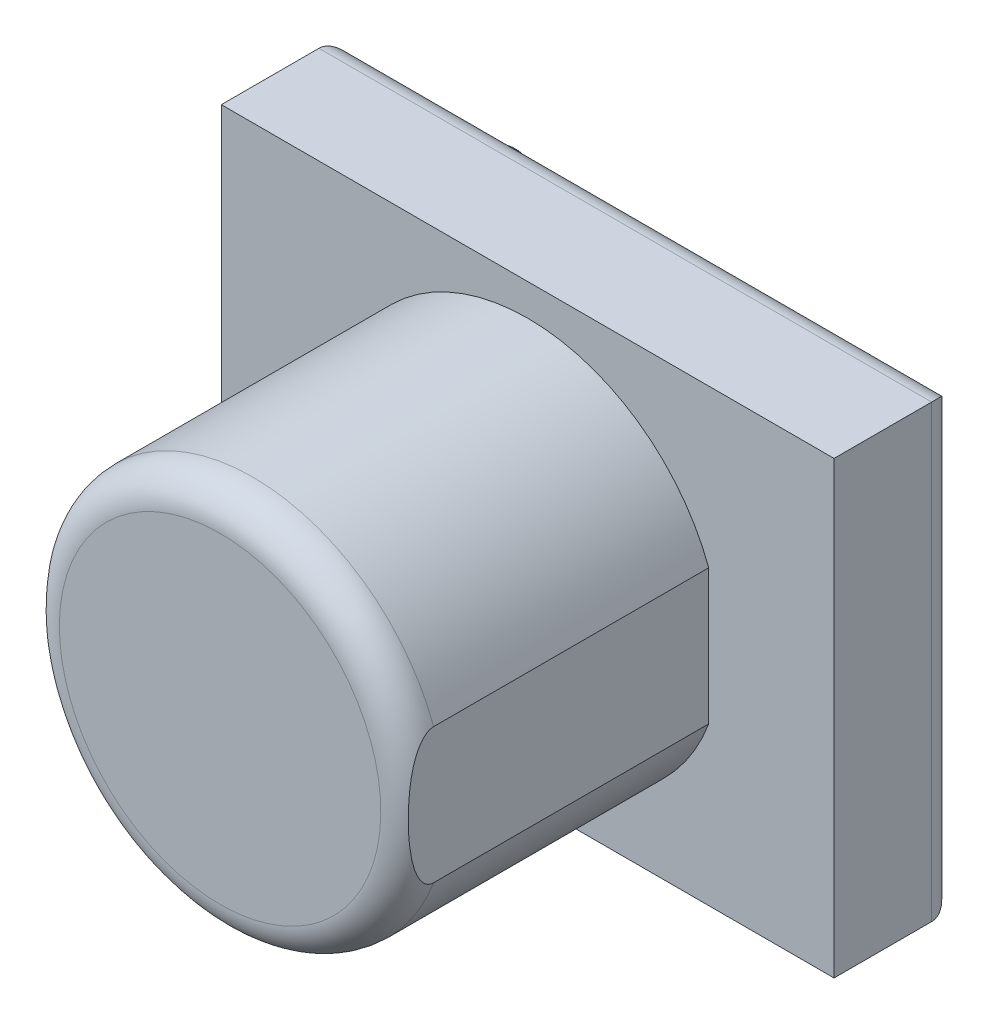
ISO-10303-21;
HEADER;
FILE_DESCRIPTION(('STEP AP214'),'2;1');
FILE_NAME('part.step','',(''),(''),'','','');
FILE_SCHEMA(('AUTOMOTIVE_DESIGN { 1 0 10303 214 1 1 1 1 }'));
ENDSEC;
DATA;
#1=APPLICATION_CONTEXT('core data for automotive mechanical design processes');
#2=APPLICATION_PROTOCOL_DEFINITION('international standard','automotive_design',2000,#1);
#3=PRODUCT_CONTEXT('',#1,'mechanical');
#4=PRODUCT('Part','Part','',(#3));
#5=PRODUCT_RELATED_PRODUCT_CATEGORY('part','',(#4));
#6=PRODUCT_DEFINITION_FORMATION('','',#4);
#7=PRODUCT_DEFINITION_CONTEXT('part definition',#1,'design');
#8=PRODUCT_DEFINITION('design','',#6,#7);
#9=PRODUCT_DEFINITION_SHAPE('','',#8);
#10=(LENGTH_UNIT() NAMED_UNIT(*) SI_UNIT(.MILLI.,.METRE.));
#11=(NAMED_UNIT(*) PLANE_ANGLE_UNIT() SI_UNIT($,.RADIAN.));
#12=(NAMED_UNIT(*) SI_UNIT($,.STERADIAN.) SOLID_ANGLE_UNIT());
#13=UNCERTAINTY_MEASURE_WITH_UNIT(LENGTH_MEASURE(1.E-05),#10,'distance_accuracy_value','');
#14=(GEOMETRIC_REPRESENTATION_CONTEXT(3) GLOBAL_UNCERTAINTY_ASSIGNED_CONTEXT((#13)) GLOBAL_UNIT_ASSIGNED_CONTEXT((#10,
#11,#12)) REPRESENTATION_CONTEXT('',''));
#15=CARTESIAN_POINT('',(0.,0.,0.));
#16=DIRECTION('',(0.,0.,1.));
#17=DIRECTION('',(1.,0.,0.));
#18=AXIS2_PLACEMENT_3D('',#15,#16,#17);
#19=CARTESIAN_POINT('',(7.4041,4.3815,-6.731));
#20=DIRECTION('',(0.,-1.,0.));
#21=DIRECTION('',(0.,0.,-1.));
#22=AXIS2_PLACEMENT_3D('',#19,#20,#21);
#23=PLANE('',#22);
#24=CARTESIAN_POINT('',(16.7851672116612,4.3815,-90.3639998643346));
#25=DIRECTION('',(0.,-1.,0.));
#26=DIRECTION('',(0.,0.,-1.));
#27=AXIS2_PLACEMENT_3D('',#24,#25,#26);
#28=CIRCLE('',#27,87.8228942898299);
#29=CARTESIAN_POINT('',(1.91015901242293,4.3815,-3.81));
#30=VERTEX_POINT('',#29);
#31=CARTESIAN_POINT('',(-6.6421,4.3815,-5.72344272748641));
#32=VERTEX_POINT('',#31);
#33=EDGE_CURVE('E267',#30,#32,#28,.T.);
#34=ORIENTED_EDGE('',*,*,#33,.T.);
#35=DIRECTION('',(0.,0.,1.));
#36=VECTOR('',#35,1.);
#37=CARTESIAN_POINT('',(-6.6421,4.3815,-6.731));
#38=LINE('',#37,#36);
#39=CARTESIAN_POINT('',(-6.6421,4.3815,-3.81));
#40=VERTEX_POINT('',#39);
#41=EDGE_CURVE('E269',#32,#40,#38,.T.);
#42=ORIENTED_EDGE('',*,*,#41,.T.);
#43=DIRECTION('',(1.,0.,0.));
#44=VECTOR('',#43,1.);
#45=CARTESIAN_POINT('',(7.4041,4.3815,-3.81));
#46=LINE('',#45,#44);
#47=EDGE_CURVE('E371',#40,#30,#46,.T.);
#48=ORIENTED_EDGE('',*,*,#47,.T.);
#49=EDGE_LOOP('',(#34,#42,#48));
#50=FACE_BOUND('',#49,.T.);
#51=ADVANCED_FACE('F35',(#50),#23,.F.);
#52=CARTESIAN_POINT('',(7.4041,-4.3815,-6.731));
#53=DIRECTION('',(0.,1.,0.));
#54=DIRECTION('',(0.,0.,1.));
#55=AXIS2_PLACEMENT_3D('',#52,#53,#54);
#56=PLANE('',#55);
#57=DIRECTION('',(-1.,0.,0.));
#58=VECTOR('',#57,1.);
#59=CARTESIAN_POINT('',(7.4041,-4.3815,-3.81));
#60=LINE('',#59,#58);
#61=CARTESIAN_POINT('',(1.91015901242293,-4.3815,-3.81));
#62=VERTEX_POINT('',#61);
#63=CARTESIAN_POINT('',(-6.6421,-4.3815,-3.81));
#64=VERTEX_POINT('',#63);
#65=EDGE_CURVE('E187',#62,#64,#60,.T.);
#66=ORIENTED_EDGE('',*,*,#65,.T.);
#67=DIRECTION('',(0.,0.,1.));
#68=VECTOR('',#67,1.);
#69=CARTESIAN_POINT('',(-6.6421,-4.3815,-6.731));
#70=LINE('',#69,#68);
#71=CARTESIAN_POINT('',(-6.6421,-4.3815,-5.72344272748641));
#72=VERTEX_POINT('',#71);
#73=EDGE_CURVE('E261',#64,#72,#70,.F.);
#74=ORIENTED_EDGE('',*,*,#73,.T.);
#75=CARTESIAN_POINT('',(16.7851672116612,-4.3815,-90.3639998643346));
#76=DIRECTION('',(0.,1.,0.));
#77=DIRECTION('',(0.,0.,1.));
#78=AXIS2_PLACEMENT_3D('',#75,#76,#77);
#79=CIRCLE('',#78,87.8228942898299);
#80=EDGE_CURVE('E259',#72,#62,#79,.T.);
#81=ORIENTED_EDGE('',*,*,#80,.T.);
#82=EDGE_LOOP('',(#66,#74,#81));
#83=FACE_BOUND('',#82,.T.);
#84=ADVANCED_FACE('F323',(#83),#56,.F.);
#85=CARTESIAN_POINT('',(0.,0.,-3.81));
#86=DIRECTION('',(0.,0.,1.));
#87=DIRECTION('',(1.,0.,0.));
#88=AXIS2_PLACEMENT_3D('',#85,#86,#87);
#89=PLANE('',#88);
#90=DIRECTION('',(0.,1.,0.));
#91=VECTOR('',#90,1.);
#92=CARTESIAN_POINT('',(-8.80110000000001,0.,-3.81));
#93=LINE('',#92,#91);
#94=CARTESIAN_POINT('',(-8.80110000000001,-6.2611,-3.81));
#95=VERTEX_POINT('',#94);
#96=CARTESIAN_POINT('',(-8.80110000000001,6.2611,-3.81));
#97=VERTEX_POINT('',#96);
#98=EDGE_CURVE('E226',#95,#97,#93,.T.);
#99=ORIENTED_EDGE('',*,*,#98,.T.);
#100=DIRECTION('',(1.,0.,0.));
#101=VECTOR('',#100,1.);
#102=CARTESIAN_POINT('',(0.,6.2611,-3.81));
#103=LINE('',#102,#101);
#104=CARTESIAN_POINT('',(8.80109999999999,6.2611,-3.81));
#105=VERTEX_POINT('',#104);
#106=EDGE_CURVE('E232',#97,#105,#103,.T.);
#107=ORIENTED_EDGE('',*,*,#106,.T.);
#108=DIRECTION('',(0.,-1.,0.));
#109=VECTOR('',#108,1.);
#110=CARTESIAN_POINT('',(8.80109999999999,0.,-3.81));
#111=LINE('',#110,#109);
#112=CARTESIAN_POINT('',(8.80109999999999,-6.2611,-3.81));
#113=VERTEX_POINT('',#112);
#114=EDGE_CURVE('E230',#105,#113,#111,.T.);
#115=ORIENTED_EDGE('',*,*,#114,.T.);
#116=DIRECTION('',(-1.,0.,0.));
#117=VECTOR('',#116,1.);
#118=CARTESIAN_POINT('',(0.,-6.2611,-3.81));
#119=LINE('',#118,#117);
#120=EDGE_CURVE('E228',#113,#95,#119,.T.);
#121=ORIENTED_EDGE('',*,*,#120,.T.);
#122=EDGE_LOOP('',(#99,#107,#115,#121));
#123=FACE_BOUND('',#122,.T.);
#124=ORIENTED_EDGE('',*,*,#65,.F.);
#125=CARTESIAN_POINT('',(1.91015901242293,-4.3815,-3.81));
#126=CARTESIAN_POINT('',(2.03721907301691,-4.38149538319484,-3.81));
#127=CARTESIAN_POINT('',(2.16427622476188,-4.38058903981977,-3.81));
#128=CARTESIAN_POINT('',(2.41836507125843,-4.37706729389455,-3.81));
#129=CARTESIAN_POINT('',(2.54539676637583,-4.37445191797455,-3.81));
#130=CARTESIAN_POINT('',(2.92643429361751,-4.36418367165338,-3.81));
#131=CARTESIAN_POINT('',(3.18037841968216,-4.35410868900115,-3.81));
#132=CARTESIAN_POINT('',(3.65500995113201,-4.32950888119867,-3.81));
#133=CARTESIAN_POINT('',(3.87573704214033,-4.31573108122942,-3.81));
#134=CARTESIAN_POINT('',(4.31684315038298,-4.28339692297307,-3.81));
#135=CARTESIAN_POINT('',(4.53722217354098,-4.26484064691069,-3.81));
#136=CARTESIAN_POINT('',(4.90602510762423,-4.22927805254913,-3.81));
#137=CARTESIAN_POINT('',(5.0545896195979,-4.21372317667841,-3.81));
#138=CARTESIAN_POINT('',(5.35139661180852,-4.17980791483941,-3.81));
#139=CARTESIAN_POINT('',(5.4996391053722,-4.16144764730539,-3.81));
#140=CARTESIAN_POINT('',(5.74756345181483,-4.12777963435565,-3.81));
#141=CARTESIAN_POINT('',(5.84737311827588,-4.11341843143614,-3.81));
#142=CARTESIAN_POINT('',(6.04668822288259,-4.08273010474138,-3.81));
#143=CARTESIAN_POINT('',(6.14619366550416,-4.06640301003349,-3.81));
#144=CARTESIAN_POINT('',(6.37966891727136,-4.02505470154098,-3.81));
#145=CARTESIAN_POINT('',(6.5134624187252,-3.99899447275442,-3.81));
#146=CARTESIAN_POINT('',(6.73648799174239,-3.94874459048236,-3.81));
#147=CARTESIAN_POINT('',(6.82617659474924,-3.92666180580557,-3.81));
#148=CARTESIAN_POINT('',(6.97544224481293,-3.88419796509909,-3.81));
#149=CARTESIAN_POINT('',(7.03549113386297,-3.86552439480093,-3.81));
#150=CARTESIAN_POINT('',(7.13522729737756,-3.82959643144549,-3.81));
#151=CARTESIAN_POINT('',(7.17538826180799,-3.81373712632831,-3.81));
#152=CARTESIAN_POINT('',(7.23237022097375,-3.78735115303901,-3.81));
#153=CARTESIAN_POINT('',(7.25000996593279,-3.77861283800281,-3.81));
#154=CARTESIAN_POINT('',(7.28454305850807,-3.75978623373424,-3.81));
#155=CARTESIAN_POINT('',(7.30143779230621,-3.74970060564951,-3.81));
#156=CARTESIAN_POINT('',(7.32685018470444,-3.73222617615612,-3.81));
#157=CARTESIAN_POINT('',(7.33584738584889,-3.72554137045329,-3.81));
#158=CARTESIAN_POINT('',(7.35309899536156,-3.71125509195598,-3.81));
#159=CARTESIAN_POINT('',(7.36135415959348,-3.70365457084739,-3.81));
#160=CARTESIAN_POINT('',(7.37376899680133,-3.69024546954152,-3.81));
#161=CARTESIAN_POINT('',(7.37831965563278,-3.68480329991381,-3.81));
#162=CARTESIAN_POINT('',(7.38663981388448,-3.67334344047215,-3.81));
#163=CARTESIAN_POINT('',(7.39041052618441,-3.66732666584374,-3.81));
#164=CARTESIAN_POINT('',(7.39594865802266,-3.65637642214797,-3.81));
#165=CARTESIAN_POINT('',(7.3979821531743,-3.65157922533837,-3.81));
#166=CARTESIAN_POINT('',(7.40123938112701,-3.64172149864563,-3.81));
#167=CARTESIAN_POINT('',(7.40246560977254,-3.6366618330798,-3.81));
#168=CARTESIAN_POINT('',(7.40350983763296,-3.62954608921051,-3.81));
#169=CARTESIAN_POINT('',(7.40373046274275,-3.62754458997271,-3.81));
#170=CARTESIAN_POINT('',(7.4040256881159,-3.62352906766145,-3.81));
#171=CARTESIAN_POINT('',(7.4041001569034,-3.62151503494539,-3.81));
#172=CARTESIAN_POINT('',(7.40410000000007,-3.61950000000001,-3.81));
#173=B_SPLINE_CURVE_WITH_KNOTS('',3,(#125,#126,#127,#128,#129,#130,#131,#132,#133,#134,#135,
#136,#137,#138,#139,#140,#141,#142,#143,#144,#145,#146,#147,#148,#149,#150,#151,#152,#153,#154,
#155,#156,#157,#158,#159,#160,#161,#162,#163,#164,#165,#166,#167,#168,#169,#170,#171,#172),
.UNSPECIFIED.,.F.,.F.,(4,2,2,2,2,2,2,2,2,2,2,2,2,2,2,2,2,2,2,2,2,2,2,4),(0.,0.381171989721089,
0.762338040162242,1.52468258116649,2.18810804519521,2.85152209422006,3.29963152893147,
3.74772205118469,4.05021802485071,4.35270952640922,4.7614961919667,5.03845729453263,
5.22699693959929,5.35634299711238,5.41536855917797,5.47427921457065,5.50787013435743,
5.54142644008572,5.56266451354129,5.58386930757306,5.59944658000814,5.61497546278702,
5.62101184587061,5.62705365653806),.UNSPECIFIED.);
#174=CARTESIAN_POINT('',(7.4041,-3.6195,-3.81));
#175=VERTEX_POINT('',#174);
#176=EDGE_CURVE('E280',#62,#175,#173,.T.);
#177=ORIENTED_EDGE('',*,*,#176,.T.);
#178=DIRECTION('',(0.,-1.,0.));
#179=VECTOR('',#178,1.);
#180=CARTESIAN_POINT('',(7.4041,-4.3815,-3.81));
#181=LINE('',#180,#179);
#182=CARTESIAN_POINT('',(7.4041,3.6195,-3.81));
#183=VERTEX_POINT('',#182);
#184=EDGE_CURVE('E190',#183,#175,#181,.T.);
#185=ORIENTED_EDGE('',*,*,#184,.F.);
#186=CARTESIAN_POINT('',(7.4041,3.6195,-3.81));
#187=CARTESIAN_POINT('',(7.4041196145412,3.62500752722487,-3.81));
#188=CARTESIAN_POINT('',(7.40354673704032,3.63048526142976,-3.81));
#189=CARTESIAN_POINT('',(7.40140894198552,3.64115734736319,-3.81));
#190=CARTESIAN_POINT('',(7.39985997031857,3.64635482302832,-3.81));
#191=CARTESIAN_POINT('',(7.39539832537022,3.65785433300934,-3.81));
#192=CARTESIAN_POINT('',(7.39222354029581,3.6640517893248,-3.81));
#193=CARTESIAN_POINT('',(7.38493577552673,3.67590291684918,-3.81));
#194=CARTESIAN_POINT('',(7.3808163811141,3.68155247582676,-3.81));
#195=CARTESIAN_POINT('',(7.36808931674334,3.69704219669775,-3.81));
#196=CARTESIAN_POINT('',(7.35870417076715,3.70623238032404,-3.81));
#197=CARTESIAN_POINT('',(7.33884545916057,3.72330351492902,-3.81));
#198=CARTESIAN_POINT('',(7.3283696419005,3.73118166656245,-3.81));
#199=CARTESIAN_POINT('',(7.29824374674258,3.75189631767605,-3.81));
#200=CARTESIAN_POINT('',(7.27790211161918,3.76371474838724,-3.81));
#201=CARTESIAN_POINT('',(7.23628117231781,3.78559569563946,-3.81));
#202=CARTESIAN_POINT('',(7.21499946015498,3.79565333099825,-3.81));
#203=CARTESIAN_POINT('',(7.17177907775858,3.81460908631944,-3.81));
#204=CARTESIAN_POINT('',(7.149837289905,3.82350007037336,-3.81));
#205=CARTESIAN_POINT('',(7.10564887993966,3.84037547255194,-3.81));
#206=CARTESIAN_POINT('',(7.08340271914615,3.84836112205564,-3.81));
#207=CARTESIAN_POINT('',(7.01688866938952,3.8711125755934,-3.81));
#208=CARTESIAN_POINT('',(6.97228780778271,3.88490160124983,-3.81));
#209=CARTESIAN_POINT('',(6.88258580797554,3.91075893113641,-3.81));
#210=CARTESIAN_POINT('',(6.83748447363379,3.92282653305899,-3.81));
#211=CARTESIAN_POINT('',(6.7015766532405,3.95720893416734,-3.81));
#212=CARTESIAN_POINT('',(6.61030121052831,3.9776612560019,-3.81));
#213=CARTESIAN_POINT('',(6.42732919065612,4.01548098507401,-3.81));
#214=CARTESIAN_POINT('',(6.33563381587022,4.03285446123167,-3.81));
#215=CARTESIAN_POINT('',(6.15193810911629,4.06538476028314,-3.81));
#216=CARTESIAN_POINT('',(6.05993812693215,4.08054356896845,-3.81));
#217=CARTESIAN_POINT('',(5.79879906623099,4.12112558189946,-3.81));
#218=CARTESIAN_POINT('',(5.62935261643371,4.14455850621889,-3.81));
#219=CARTESIAN_POINT('',(5.28993698098084,4.18734077593733,-3.81));
#220=CARTESIAN_POINT('',(5.11996773235853,4.206689608204,-3.81));
#221=CARTESIAN_POINT('',(4.77952147120729,4.24203110527046,-3.81));
#222=CARTESIAN_POINT('',(4.60904413202668,4.25802060647706,-3.81));
#223=CARTESIAN_POINT('',(4.26784485464998,4.2869960001063,-3.81));
#224=CARTESIAN_POINT('',(4.09712292903563,4.29998204181556,-3.81));
#225=CARTESIAN_POINT('',(3.7583976323741,4.32292054617977,-3.81));
#226=CARTESIAN_POINT('',(3.5903974980628,4.33292092185793,-3.81));
#227=CARTESIAN_POINT('',(3.25425680646727,4.35021173202811,-3.81));
#228=CARTESIAN_POINT('',(3.08611624828298,4.35750214901482,-3.81));
#229=CARTESIAN_POINT('',(2.7500333899929,4.36930189120264,-3.81));
#230=CARTESIAN_POINT('',(2.58209126329123,4.37381609906911,-3.81));
#231=CARTESIAN_POINT('',(2.24615367109289,4.37990617886817,-3.81));
#232=CARTESIAN_POINT('',(2.0781582054123,4.38148204055629,-3.81));
#233=CARTESIAN_POINT('',(1.91015901242293,4.3815,-3.81));
#234=B_SPLINE_CURVE_WITH_KNOTS('',3,(#186,#187,#188,#189,#190,#191,#192,#193,#194,#195,#196,
#197,#198,#199,#200,#201,#202,#203,#204,#205,#206,#207,#208,#209,#210,#211,#212,#213,#214,#215,
#216,#217,#218,#219,#220,#221,#222,#223,#224,#225,#226,#227,#228,#229,#230,#231,#232,#233),
.UNSPECIFIED.,.F.,.F.,(4,2,2,2,2,2,2,2,2,2,2,2,2,2,2,2,2,2,2,2,2,2,2,4),(0.,0.0164451936761808,
0.0326284591598422,0.0533995711749799,0.0743161488389807,0.113502781429064,0.152771980042276,
0.223160125374958,0.293740409270173,0.364734060070483,0.435629960967294,0.57561766954099,
0.715662328040405,0.996174789064382,1.27612800915304,1.55582864669351,2.06892963359268,
2.58209504905816,3.09574158438458,3.60936258347763,4.11423316886356,4.61910701546386,
5.12309035529566,5.62707545225162),.UNSPECIFIED.);
#235=EDGE_CURVE('E287',#183,#30,#234,.T.);
#236=ORIENTED_EDGE('',*,*,#235,.T.);
#237=ORIENTED_EDGE('',*,*,#47,.F.);
#238=CARTESIAN_POINT('',(-6.6421,3.6195,-3.81));
#239=DIRECTION('',(0.,0.,1.));
#240=DIRECTION('',(1.,0.,0.));
#241=AXIS2_PLACEMENT_3D('',#238,#239,#240);
#242=CIRCLE('',#241,0.762);
#243=CARTESIAN_POINT('',(-7.4041,3.6195,-3.81));
#244=VERTEX_POINT('',#243);
#245=EDGE_CURVE('E278',#40,#244,#242,.T.);
#246=ORIENTED_EDGE('',*,*,#245,.T.);
#247=DIRECTION('',(0.,1.,0.));
#248=VECTOR('',#247,1.);
#249=CARTESIAN_POINT('',(-7.4041,-4.3815,-3.81));
#250=LINE('',#249,#248);
#251=CARTESIAN_POINT('',(-7.4041,-3.6195,-3.81));
#252=VERTEX_POINT('',#251);
#253=EDGE_CURVE('E254',#252,#244,#250,.T.);
#254=ORIENTED_EDGE('',*,*,#253,.F.);
#255=CARTESIAN_POINT('',(-6.6421,-3.6195,-3.81));
#256=DIRECTION('',(0.,0.,1.));
#257=DIRECTION('',(1.,0.,0.));
#258=AXIS2_PLACEMENT_3D('',#255,#256,#257);
#259=CIRCLE('',#258,0.762);
#260=EDGE_CURVE('E276',#252,#64,#259,.T.);
#261=ORIENTED_EDGE('',*,*,#260,.T.);
#262=EDGE_LOOP('',(#124,#177,#185,#236,#237,#246,#254,#261));
#263=FACE_BOUND('',#262,.T.);
#264=ADVANCED_FACE('F292',(#123,#263),#89,.F.);
#265=CARTESIAN_POINT('',(0.,0.,9.6012));
#266=DIRECTION('',(0.,0.,-1.));
#267=DIRECTION('',(-1.,0.,0.));
#268=AXIS2_PLACEMENT_3D('',#265,#266,#267);
#269=CYLINDRICAL_SURFACE('',#268,6.0325);
#270=DIRECTION('',(0.,0.,-1.));
#271=VECTOR('',#270,1.);
#272=CARTESIAN_POINT('',(-5.6515,2.10988246118119,9.6012));
#273=LINE('',#272,#271);
#274=CARTESIAN_POINT('',(-5.6515,2.10988246118119,8.5852));
#275=VERTEX_POINT('',#274);
#276=CARTESIAN_POINT('',(-5.6515,2.10988246118119,0.));
#277=VERTEX_POINT('',#276);
#278=EDGE_CURVE('E218',#275,#277,#273,.T.);
#279=ORIENTED_EDGE('',*,*,#278,.F.);
#280=CARTESIAN_POINT('',(0.,0.,8.5852));
#281=DIRECTION('',(0.,0.,-1.));
#282=DIRECTION('',(-1.,0.,0.));
#283=AXIS2_PLACEMENT_3D('',#280,#281,#282);
#284=CIRCLE('',#283,6.0325);
#285=CARTESIAN_POINT('',(5.6515,2.10988246118119,8.5852));
#286=VERTEX_POINT('',#285);
#287=EDGE_CURVE('E48',#275,#286,#284,.T.);
#288=ORIENTED_EDGE('',*,*,#287,.T.);
#289=DIRECTION('',(0.,0.,-1.));
#290=VECTOR('',#289,1.);
#291=CARTESIAN_POINT('',(5.6515,2.10988246118119,9.6012));
#292=LINE('',#291,#290);
#293=CARTESIAN_POINT('',(5.6515,2.10988246118119,0.));
#294=VERTEX_POINT('',#293);
#295=EDGE_CURVE('E212',#286,#294,#292,.T.);
#296=ORIENTED_EDGE('',*,*,#295,.T.);
#297=CARTESIAN_POINT('',(0.,0.,0.));
#298=DIRECTION('',(0.,0.,1.));
#299=DIRECTION('',(1.,0.,0.));
#300=AXIS2_PLACEMENT_3D('',#297,#298,#299);
#301=CIRCLE('',#300,6.0325);
#302=EDGE_CURVE('E171',#294,#277,#301,.T.);
#303=ORIENTED_EDGE('',*,*,#302,.T.);
#304=EDGE_LOOP('',(#279,#288,#296,#303));
#305=FACE_BOUND('',#304,.T.);
#306=ADVANCED_FACE('F399',(#305),#269,.T.);
#307=CARTESIAN_POINT('',(-5.6515,0.,9.6012));
#308=DIRECTION('',(-1.,0.,0.));
#309=DIRECTION('',(0.,0.,1.));
#310=AXIS2_PLACEMENT_3D('',#307,#308,#309);
#311=PLANE('',#310);
#312=DIRECTION('',(0.,0.,-1.));
#313=VECTOR('',#312,1.);
#314=CARTESIAN_POINT('',(-5.6515,-2.10988246118119,9.6012));
#315=LINE('',#314,#313);
#316=CARTESIAN_POINT('',(-5.6515,-2.10988246118119,8.5852));
#317=VERTEX_POINT('',#316);
#318=CARTESIAN_POINT('',(-5.6515,-2.10988246118119,0.));
#319=VERTEX_POINT('',#318);
#320=EDGE_CURVE('E216',#317,#319,#315,.T.);
#321=ORIENTED_EDGE('',*,*,#320,.F.);
#322=CARTESIAN_POINT('',(-5.6515,-2.10988246118118,8.5852));
#323=CARTESIAN_POINT('',(-5.6515,-2.10994230401085,8.60733971634515));
#324=CARTESIAN_POINT('',(-5.6515,-2.10781691683647,8.62940932197027));
#325=CARTESIAN_POINT('',(-5.6515,-2.09973112516823,8.67261518543018));
#326=CARTESIAN_POINT('',(-5.6515,-2.09380961762605,8.69375861202256));
#327=CARTESIAN_POINT('',(-5.6515,-2.07867543212663,8.73471439634891));
#328=CARTESIAN_POINT('',(-5.6515,-2.06947472263846,8.75453128729416));
#329=CARTESIAN_POINT('',(-5.6515,-2.04841108520265,8.79273579367688));
#330=CARTESIAN_POINT('',(-5.6515,-2.03654101347359,8.81111939215792));
#331=CARTESIAN_POINT('',(-5.6515,-2.00119536891273,8.85938603194144));
#332=CARTESIAN_POINT('',(-5.6515,-1.97562501778916,8.88772962594944));
#333=CARTESIAN_POINT('',(-5.6515,-1.92052505834135,8.94024501799968));
#334=CARTESIAN_POINT('',(-5.6515,-1.89098418195997,8.96440447803269));
#335=CARTESIAN_POINT('',(-5.6515,-1.83142345025009,9.00767555231954));
#336=CARTESIAN_POINT('',(-5.6515,-1.80156746479967,9.02701658022521));
#337=CARTESIAN_POINT('',(-5.6515,-1.74031224039332,9.06310049782532));
#338=CARTESIAN_POINT('',(-5.6515,-1.708911598644,9.07984096622508));
#339=CARTESIAN_POINT('',(-5.6515,-1.61301560718112,9.12682341605172));
#340=CARTESIAN_POINT('',(-5.6515,-1.54690837068286,9.15377120490508));
#341=CARTESIAN_POINT('',(-5.6515,-1.43011971974818,9.19498502772334));
#342=CARTESIAN_POINT('',(-5.6515,-1.37992605959809,9.21072451302271));
#343=CARTESIAN_POINT('',(-5.6515,-1.27871451696579,9.23930988383535));
#344=CARTESIAN_POINT('',(-5.6515,-1.22769653845088,9.2521554295628));
#345=CARTESIAN_POINT('',(-5.6515,-1.07364997765131,9.28714862426017));
#346=CARTESIAN_POINT('',(-5.6515,-0.969808769931159,9.30569391007103));
#347=CARTESIAN_POINT('',(-5.6515,-0.760774700814629,9.33583369590788));
#348=CARTESIAN_POINT('',(-5.6515,-0.655578124245571,9.34740050002659));
#349=CARTESIAN_POINT('',(-5.6515,-0.444703336775165,9.36493518742751));
#350=CARTESIAN_POINT('',(-5.6515,-0.339025003069184,9.37090155245408));
#351=CARTESIAN_POINT('',(-5.6515,-0.117652686210914,9.37830396677755));
#352=CARTESIAN_POINT('',(-5.6515,-0.00194346079580698,9.37926580871908));
#353=CARTESIAN_POINT('',(-5.6515,0.229470552632344,9.37552765663169));
#354=CARTESIAN_POINT('',(-5.6515,0.345175281418888,9.37082371853453));
#355=CARTESIAN_POINT('',(-5.6515,0.576101183611983,9.35505423642327));
#356=CARTESIAN_POINT('',(-5.6515,0.691322576713793,9.3439919935344));
#357=CARTESIAN_POINT('',(-5.6515,0.920666722899536,9.31387094812962));
#358=CARTESIAN_POINT('',(-5.6515,1.03479062676,9.29482174109552));
#359=CARTESIAN_POINT('',(-5.6515,1.20479017011275,9.25774147969901));
#360=CARTESIAN_POINT('',(-5.6515,1.26156800565755,9.24386336718823));
#361=CARTESIAN_POINT('',(-5.6515,1.37413698272564,9.21259559442015));
#362=CARTESIAN_POINT('',(-5.6515,1.42992865385843,9.19520788537376));
#363=CARTESIAN_POINT('',(-5.6515,1.5396650277194,9.15615650639768));
#364=CARTESIAN_POINT('',(-5.6515,1.59361837426297,9.13451751194959));
#365=CARTESIAN_POINT('',(-5.6515,1.69892191972909,9.08571481466067));
#366=CARTESIAN_POINT('',(-5.6515,1.75027781041186,9.05856390908177));
#367=CARTESIAN_POINT('',(-5.6515,1.83456514823494,9.00571695419701));
#368=CARTESIAN_POINT('',(-5.6515,1.8685929703219,8.98178980637961));
#369=CARTESIAN_POINT('',(-5.6515,1.93297076850157,8.92936258511768));
#370=CARTESIAN_POINT('',(-5.6515,1.96332824938778,8.90087212964076));
#371=CARTESIAN_POINT('',(-5.6515,2.00780065751003,8.85021462338803));
#372=CARTESIAN_POINT('',(-5.6515,2.02374498419054,8.82966550659597));
#373=CARTESIAN_POINT('',(-5.6515,2.0523988826327,8.78641640166074));
#374=CARTESIAN_POINT('',(-5.6515,2.0651138802203,8.76372011041152));
#375=CARTESIAN_POINT('',(-5.6515,2.08442769243476,8.72054053733016));
#376=CARTESIAN_POINT('',(-5.6515,2.0917074294925,8.70036500879006));
#377=CARTESIAN_POINT('',(-5.6515,2.10279398285831,8.65907820573917));
#378=CARTESIAN_POINT('',(-5.6515,2.10660432299081,8.63796790357802));
#379=CARTESIAN_POINT('',(-5.6515,2.11037122769398,8.5953819886954));
#380=CARTESIAN_POINT('',(-5.6515,2.11032380291898,8.57390602077406));
#381=CARTESIAN_POINT('',(-5.6515,2.10643650509724,8.53116023935907));
#382=CARTESIAN_POINT('',(-5.6515,2.10257232272665,8.50989262993523));
#383=CARTESIAN_POINT('',(-5.6515,2.09683646282022,8.48914860325494));
#384=B_SPLINE_CURVE_WITH_KNOTS('',3,(#322,#323,#324,#325,#326,#327,#328,#329,#330,#331,#332,
#333,#334,#335,#336,#337,#338,#339,#340,#341,#342,#343,#344,#345,#346,#347,#348,#349,#350,#351,
#352,#353,#354,#355,#356,#357,#358,#359,#360,#361,#362,#363,#364,#365,#366,#367,#368,#369,#370,
#371,#372,#373,#374,#375,#376,#377,#378,#379,#380,#381,#382,#383),.UNSPECIFIED.,.F.,.F.,(4,2,2,
2,2,2,2,2,2,2,2,2,2,2,2,2,2,2,2,2,2,2,2,2,2,2,2,2,2,2,4),(0.,0.0662060506650487,
0.131744334180624,0.197045824489486,0.262524200354777,0.376382179806134,0.490570384980289,
0.597129383496998,0.703787008483754,0.917396455325442,1.07513537442664,1.23289280446905,
1.54897323506306,1.86629999888681,2.18371276384614,2.53071721054849,2.87796335399004,
3.2250293756949,3.57167962412396,3.74694418135708,3.92211156479946,4.09629077051296,
4.27007010849575,4.394593304286,4.51885741816986,4.59666536098091,4.67434169514316,
4.73842526696246,4.80244367703098,4.86652828989232,4.93102371349861),.UNSPECIFIED.);
#385=EDGE_CURVE('E388',#317,#275,#384,.T.);
#386=ORIENTED_EDGE('',*,*,#385,.T.);
#387=ORIENTED_EDGE('',*,*,#278,.T.);
#388=DIRECTION('',(0.,1.,0.));
#389=VECTOR('',#388,1.);
#390=CARTESIAN_POINT('',(-5.6515,0.,0.));
#391=LINE('',#390,#389);
#392=EDGE_CURVE('E203',#319,#277,#391,.T.);
#393=ORIENTED_EDGE('',*,*,#392,.F.);
#394=EDGE_LOOP('',(#321,#386,#387,#393));
#395=FACE_BOUND('',#394,.T.);
#396=ADVANCED_FACE('F393',(#395),#311,.T.);
#397=CARTESIAN_POINT('',(0.,0.,9.6012));
#398=DIRECTION('',(0.,0.,-1.));
#399=DIRECTION('',(-1.,0.,0.));
#400=AXIS2_PLACEMENT_3D('',#397,#398,#399);
#401=CYLINDRICAL_SURFACE('',#400,6.0325);
#402=DIRECTION('',(0.,0.,-1.));
#403=VECTOR('',#402,1.);
#404=CARTESIAN_POINT('',(5.6515,-2.10988246118119,9.6012));
#405=LINE('',#404,#403);
#406=CARTESIAN_POINT('',(5.6515,-2.10988246118119,8.58520000000041));
#407=VERTEX_POINT('',#406);
#408=CARTESIAN_POINT('',(5.6515,-2.10988246118119,0.));
#409=VERTEX_POINT('',#408);
#410=EDGE_CURVE('E214',#407,#409,#405,.T.);
#411=ORIENTED_EDGE('',*,*,#410,.F.);
#412=CARTESIAN_POINT('',(0.,0.,8.5852));
#413=DIRECTION('',(0.,0.,1.));
#414=DIRECTION('',(1.,0.,0.));
#415=AXIS2_PLACEMENT_3D('',#412,#413,#414);
#416=CIRCLE('',#415,6.0325);
#417=EDGE_CURVE('E385',#407,#317,#416,.F.);
#418=ORIENTED_EDGE('',*,*,#417,.T.);
#419=ORIENTED_EDGE('',*,*,#320,.T.);
#420=CARTESIAN_POINT('',(0.,0.,0.));
#421=DIRECTION('',(0.,0.,1.));
#422=DIRECTION('',(1.,0.,0.));
#423=AXIS2_PLACEMENT_3D('',#420,#421,#422);
#424=CIRCLE('',#423,6.0325);
#425=EDGE_CURVE('E206',#319,#409,#424,.T.);
#426=ORIENTED_EDGE('',*,*,#425,.T.);
#427=EDGE_LOOP('',(#411,#418,#419,#426));
#428=FACE_BOUND('',#427,.T.);
#429=ADVANCED_FACE('F398',(#428),#401,.T.);
#430=CARTESIAN_POINT('',(5.6515,0.,9.6012));
#431=DIRECTION('',(-1.,0.,0.));
#432=DIRECTION('',(0.,0.,1.));
#433=AXIS2_PLACEMENT_3D('',#430,#431,#432);
#434=PLANE('',#433);
#435=ORIENTED_EDGE('',*,*,#295,.F.);
#436=CARTESIAN_POINT('',(5.6515,2.10988246118119,8.5852));
#437=CARTESIAN_POINT('',(5.6515,2.10994230401085,8.60733971634515));
#438=CARTESIAN_POINT('',(5.6515,2.10781691683648,8.62940932197027));
#439=CARTESIAN_POINT('',(5.6515,2.09973112516823,8.67261518543018));
#440=CARTESIAN_POINT('',(5.6515,2.09380961762606,8.69375861202257));
#441=CARTESIAN_POINT('',(5.6515,2.07867543212664,8.73471439634891));
#442=CARTESIAN_POINT('',(5.6515,2.06947472263846,8.75453128729416));
#443=CARTESIAN_POINT('',(5.6515,2.04841108520266,8.79273579367688));
#444=CARTESIAN_POINT('',(5.6515,2.0365410134736,8.81111939215792));
#445=CARTESIAN_POINT('',(5.6515,2.00119536891273,8.85938603194144));
#446=CARTESIAN_POINT('',(5.6515,1.97562501778917,8.88772962594944));
#447=CARTESIAN_POINT('',(5.6515,1.92052505834136,8.94024501799968));
#448=CARTESIAN_POINT('',(5.6515,1.89098418195997,8.96440447803269));
#449=CARTESIAN_POINT('',(5.6515,1.83142345025009,9.00767555231954));
#450=CARTESIAN_POINT('',(5.6515,1.80156746479967,9.02701658022521));
#451=CARTESIAN_POINT('',(5.6515,1.74031224039332,9.06310049782532));
#452=CARTESIAN_POINT('',(5.6515,1.70891159864401,9.07984096622508));
#453=CARTESIAN_POINT('',(5.6515,1.61301560718112,9.12682341605172));
#454=CARTESIAN_POINT('',(5.6515,1.54690837068286,9.15377120490508));
#455=CARTESIAN_POINT('',(5.6515,1.43011971974819,9.19498502772334));
#456=CARTESIAN_POINT('',(5.6515,1.37992605959809,9.21072451302271));
#457=CARTESIAN_POINT('',(5.6515,1.2787145169658,9.23930988383535));
#458=CARTESIAN_POINT('',(5.6515,1.22769653845088,9.2521554295628));
#459=CARTESIAN_POINT('',(5.6515,1.07364997765132,9.28714862426017));
#460=CARTESIAN_POINT('',(5.6515,0.969808769931165,9.30569391007103));
#461=CARTESIAN_POINT('',(5.6515,0.760774700814636,9.33583369590788));
#462=CARTESIAN_POINT('',(5.6515,0.655578124245579,9.34740050002659));
#463=CARTESIAN_POINT('',(5.6515,0.444703336775174,9.36493518742751));
#464=CARTESIAN_POINT('',(5.6515,0.339025003069193,9.37090155245408));
#465=CARTESIAN_POINT('',(5.6515,0.117652686210924,9.37830396677755));
#466=CARTESIAN_POINT('',(5.6515,0.0019434607958167,9.37926580871909));
#467=CARTESIAN_POINT('',(5.6515,-0.229470552632334,9.37552765663169));
#468=CARTESIAN_POINT('',(5.6515,-0.345175281418879,9.37082371853453));
#469=CARTESIAN_POINT('',(5.6515,-0.576101183611974,9.35505423642327));
#470=CARTESIAN_POINT('',(5.6515,-0.691322576713784,9.3439919935344));
#471=CARTESIAN_POINT('',(5.6515,-0.920666722899527,9.31387094812962));
#472=CARTESIAN_POINT('',(5.6515,-1.03479062675999,9.29482174109552));
#473=CARTESIAN_POINT('',(5.6515,-1.20479017011274,9.25774147969902));
#474=CARTESIAN_POINT('',(5.6515,-1.26156800565754,9.24386336718824));
#475=CARTESIAN_POINT('',(5.6515,-1.37413698272563,9.21259559442015));
#476=CARTESIAN_POINT('',(5.6515,-1.42992865385842,9.19520788537376));
#477=CARTESIAN_POINT('',(5.6515,-1.53966502771939,9.15615650639769));
#478=CARTESIAN_POINT('',(5.6515,-1.59361837426297,9.13451751194959));
#479=CARTESIAN_POINT('',(5.6515,-1.69892191972908,9.08571481466067));
#480=CARTESIAN_POINT('',(5.6515,-1.75027781041185,9.05856390908177));
#481=CARTESIAN_POINT('',(5.6515,-1.83456514823493,9.00571695419702));
#482=CARTESIAN_POINT('',(5.6515,-1.86859297032189,8.98178980637962));
#483=CARTESIAN_POINT('',(5.6515,-1.93297076850156,8.92936258511768));
#484=CARTESIAN_POINT('',(5.6515,-1.96332824938778,8.90087212964077));
#485=CARTESIAN_POINT('',(5.6515,-2.00780065751003,8.85021462338804));
#486=CARTESIAN_POINT('',(5.6515,-2.02374498419054,8.82966550659598));
#487=CARTESIAN_POINT('',(5.6515,-2.0523988826327,8.78641640166074));
#488=CARTESIAN_POINT('',(5.6515,-2.0651138802203,8.76372011041152));
#489=CARTESIAN_POINT('',(5.6515,-2.08442769243477,8.72054053733017));
#490=CARTESIAN_POINT('',(5.6515,-2.0917074294925,8.70036500879006));
#491=CARTESIAN_POINT('',(5.6515,-2.10279398285832,8.65907820573918));
#492=CARTESIAN_POINT('',(5.6515,-2.10660432299081,8.63796790357802));
#493=CARTESIAN_POINT('',(5.6515,-2.11037122769398,8.59538198869541));
#494=CARTESIAN_POINT('',(5.6515,-2.11032380291898,8.57390602077406));
#495=CARTESIAN_POINT('',(5.6515,-2.10643650509725,8.53116023935907));
#496=CARTESIAN_POINT('',(5.6515,-2.10257232272666,8.50989262993524));
#497=CARTESIAN_POINT('',(5.6515,-2.09683646282023,8.48914860325494));
#498=B_SPLINE_CURVE_WITH_KNOTS('',3,(#436,#437,#438,#439,#440,#441,#442,#443,#444,#445,#446,
#447,#448,#449,#450,#451,#452,#453,#454,#455,#456,#457,#458,#459,#460,#461,#462,#463,#464,#465,
#466,#467,#468,#469,#470,#471,#472,#473,#474,#475,#476,#477,#478,#479,#480,#481,#482,#483,#484,
#485,#486,#487,#488,#489,#490,#491,#492,#493,#494,#495,#496,#497),.UNSPECIFIED.,.F.,.F.,(4,2,2,
2,2,2,2,2,2,2,2,2,2,2,2,2,2,2,2,2,2,2,2,2,2,2,2,2,2,2,4),(0.,0.0662060506650523,
0.131744334180623,0.197045824489486,0.262524200354777,0.376382179806135,0.49057038498029,
0.597129383496998,0.703787008483754,0.917396455325442,1.07513537442664,1.23289280446905,
1.54897323506306,1.86629999888681,2.18371276384614,2.53071721054849,2.87796335399004,
3.2250293756949,3.57167962412396,3.74694418135707,3.92211156479946,4.09629077051296,
4.27007010849574,4.394593304286,4.51885741816987,4.59666536098092,4.67434169514317,
4.73842526696246,4.80244367703099,4.86652828989233,4.93102371349862),.UNSPECIFIED.);
#499=EDGE_CURVE('E11',#286,#407,#498,.T.);
#500=ORIENTED_EDGE('',*,*,#499,.T.);
#501=ORIENTED_EDGE('',*,*,#410,.T.);
#502=DIRECTION('',(0.,1.,0.));
#503=VECTOR('',#502,1.);
#504=CARTESIAN_POINT('',(5.6515,0.,0.));
#505=LINE('',#504,#503);
#506=EDGE_CURVE('E209',#409,#294,#505,.T.);
#507=ORIENTED_EDGE('',*,*,#506,.T.);
#508=EDGE_LOOP('',(#435,#500,#501,#507));
#509=FACE_BOUND('',#508,.T.);
#510=ADVANCED_FACE('F455',(#509),#434,.F.);
#511=CARTESIAN_POINT('',(0.,0.,9.6012));
#512=DIRECTION('',(0.,0.,1.));
#513=DIRECTION('',(1.,0.,0.));
#514=AXIS2_PLACEMENT_3D('',#511,#512,#513);
#515=PLANE('',#514);
#516=CARTESIAN_POINT('',(0.,0.,9.6012));
#517=DIRECTION('',(0.,0.,1.));
#518=DIRECTION('',(1.,0.,0.));
#519=AXIS2_PLACEMENT_3D('',#516,#517,#518);
#520=CIRCLE('',#519,5.0165);
#521=CARTESIAN_POINT('',(-4.69966842105263,-1.75453383614015,9.6012));
#522=VERTEX_POINT('',#521);
#523=EDGE_CURVE('E53',#522,#522,#520,.T.);
#524=ORIENTED_EDGE('',*,*,#523,.T.);
#525=EDGE_LOOP('',(#524));
#526=FACE_BOUND('',#525,.T.);
#527=ADVANCED_FACE('F462',(#526),#515,.T.);
#528=CARTESIAN_POINT('',(0.,0.,0.));
#529=DIRECTION('',(0.,0.,1.));
#530=DIRECTION('',(1.,0.,0.));
#531=AXIS2_PLACEMENT_3D('',#528,#529,#530);
#532=PLANE('',#531);
#533=DIRECTION('',(0.,1.,0.));
#534=VECTOR('',#533,1.);
#535=CARTESIAN_POINT('',(-9.56310000000001,-7.0231,0.));
#536=LINE('',#535,#534);
#537=CARTESIAN_POINT('',(-9.56310000000001,-7.0231,0.));
#538=VERTEX_POINT('',#537);
#539=CARTESIAN_POINT('',(-9.56310000000001,7.0231,0.));
#540=VERTEX_POINT('',#539);
#541=EDGE_CURVE('E179',#538,#540,#536,.T.);
#542=ORIENTED_EDGE('',*,*,#541,.F.);
#543=DIRECTION('',(-1.,0.,0.));
#544=VECTOR('',#543,1.);
#545=CARTESIAN_POINT('',(9.5631,-7.0231,0.));
#546=LINE('',#545,#544);
#547=CARTESIAN_POINT('',(9.5631,-7.0231,0.));
#548=VERTEX_POINT('',#547);
#549=EDGE_CURVE('E195',#548,#538,#546,.T.);
#550=ORIENTED_EDGE('',*,*,#549,.F.);
#551=DIRECTION('',(0.,-1.,0.));
#552=VECTOR('',#551,1.);
#553=CARTESIAN_POINT('',(9.5631,-7.0231,0.));
#554=LINE('',#553,#552);
#555=CARTESIAN_POINT('',(9.5631,7.0231,0.));
#556=VERTEX_POINT('',#555);
#557=EDGE_CURVE('E181',#556,#548,#554,.T.);
#558=ORIENTED_EDGE('',*,*,#557,.F.);
#559=DIRECTION('',(1.,0.,0.));
#560=VECTOR('',#559,1.);
#561=CARTESIAN_POINT('',(9.5631,7.0231,0.));
#562=LINE('',#561,#560);
#563=EDGE_CURVE('E165',#540,#556,#562,.T.);
#564=ORIENTED_EDGE('',*,*,#563,.F.);
#565=EDGE_LOOP('',(#542,#550,#558,#564));
#566=FACE_BOUND('',#565,.T.);
#567=ORIENTED_EDGE('',*,*,#302,.F.);
#568=ORIENTED_EDGE('',*,*,#506,.F.);
#569=ORIENTED_EDGE('',*,*,#425,.F.);
#570=ORIENTED_EDGE('',*,*,#392,.T.);
#571=EDGE_LOOP('',(#567,#568,#569,#570));
#572=FACE_BOUND('',#571,.T.);
#573=ADVANCED_FACE('F176',(#566,#572),#532,.T.);
#574=CARTESIAN_POINT('',(-9.56310000000001,-7.0231,-3.81));
#575=DIRECTION('',(1.,0.,0.));
#576=DIRECTION('',(0.,0.,-1.));
#577=AXIS2_PLACEMENT_3D('',#574,#575,#576);
#578=PLANE('',#577);
#579=DIRECTION('',(0.,0.,1.));
#580=VECTOR('',#579,1.);
#581=CARTESIAN_POINT('',(-9.56310000000001,7.0231,-3.81));
#582=LINE('',#581,#580);
#583=CARTESIAN_POINT('',(-9.56310000000001,7.0231,-3.048));
#584=VERTEX_POINT('',#583);
#585=EDGE_CURVE('E161',#584,#540,#582,.T.);
#586=ORIENTED_EDGE('',*,*,#585,.F.);
#587=DIRECTION('',(0.,1.,0.));
#588=VECTOR('',#587,1.);
#589=CARTESIAN_POINT('',(-9.56310000000001,-7.0231,-3.048));
#590=LINE('',#589,#588);
#591=CARTESIAN_POINT('',(-9.56310000000001,-7.0231,-3.048));
#592=VERTEX_POINT('',#591);
#593=EDGE_CURVE('E240',#584,#592,#590,.F.);
#594=ORIENTED_EDGE('',*,*,#593,.T.);
#595=DIRECTION('',(0.,0.,1.));
#596=VECTOR('',#595,1.);
#597=CARTESIAN_POINT('',(-9.56310000000001,-7.0231,-3.81));
#598=LINE('',#597,#596);
#599=EDGE_CURVE('E185',#592,#538,#598,.T.);
#600=ORIENTED_EDGE('',*,*,#599,.T.);
#601=ORIENTED_EDGE('',*,*,#541,.T.);
#602=EDGE_LOOP('',(#586,#594,#600,#601));
#603=FACE_BOUND('',#602,.T.);
#604=ADVANCED_FACE('F183',(#603),#578,.F.);
#605=CARTESIAN_POINT('',(9.5631,7.0231,-3.81));
#606=DIRECTION('',(0.,-1.,0.));
#607=DIRECTION('',(0.,0.,-1.));
#608=AXIS2_PLACEMENT_3D('',#605,#606,#607);
#609=PLANE('',#608);
#610=DIRECTION('',(0.,0.,1.));
#611=VECTOR('',#610,1.);
#612=CARTESIAN_POINT('',(9.5631,7.0231,-3.81));
#613=LINE('',#612,#611);
#614=CARTESIAN_POINT('',(9.5631,7.0231,-3.048));
#615=VERTEX_POINT('',#614);
#616=EDGE_CURVE('E172',#615,#556,#613,.T.);
#617=ORIENTED_EDGE('',*,*,#616,.F.);
#618=DIRECTION('',(1.,0.,0.));
#619=VECTOR('',#618,1.);
#620=CARTESIAN_POINT('',(9.5631,7.0231,-3.048));
#621=LINE('',#620,#619);
#622=EDGE_CURVE('E168',#615,#584,#621,.F.);
#623=ORIENTED_EDGE('',*,*,#622,.T.);
#624=ORIENTED_EDGE('',*,*,#585,.T.);
#625=ORIENTED_EDGE('',*,*,#563,.T.);
#626=EDGE_LOOP('',(#617,#623,#624,#625));
#627=FACE_BOUND('',#626,.T.);
#628=ADVANCED_FACE('F164',(#627),#609,.F.);
#629=CARTESIAN_POINT('',(9.5631,-7.0231,-3.81));
#630=DIRECTION('',(-1.,0.,0.));
#631=DIRECTION('',(0.,0.,1.));
#632=AXIS2_PLACEMENT_3D('',#629,#630,#631);
#633=PLANE('',#632);
#634=DIRECTION('',(0.,0.,1.));
#635=VECTOR('',#634,1.);
#636=CARTESIAN_POINT('',(9.5631,-7.0231,-3.81));
#637=LINE('',#636,#635);
#638=CARTESIAN_POINT('',(9.5631,-7.0231,-3.048));
#639=VERTEX_POINT('',#638);
#640=EDGE_CURVE('E198',#639,#548,#637,.T.);
#641=ORIENTED_EDGE('',*,*,#640,.F.);
#642=DIRECTION('',(0.,-1.,0.));
#643=VECTOR('',#642,1.);
#644=CARTESIAN_POINT('',(9.5631,-7.0231,-3.048));
#645=LINE('',#644,#643);
#646=EDGE_CURVE('E236',#639,#615,#645,.F.);
#647=ORIENTED_EDGE('',*,*,#646,.T.);
#648=ORIENTED_EDGE('',*,*,#616,.T.);
#649=ORIENTED_EDGE('',*,*,#557,.T.);
#650=EDGE_LOOP('',(#641,#647,#648,#649));
#651=FACE_BOUND('',#650,.T.);
#652=ADVANCED_FACE('F343',(#651),#633,.F.);
#653=CARTESIAN_POINT('',(9.5631,-7.0231,-3.81));
#654=DIRECTION('',(0.,1.,0.));
#655=DIRECTION('',(0.,0.,1.));
#656=AXIS2_PLACEMENT_3D('',#653,#654,#655);
#657=PLANE('',#656);
#658=ORIENTED_EDGE('',*,*,#599,.F.);
#659=DIRECTION('',(-1.,0.,0.));
#660=VECTOR('',#659,1.);
#661=CARTESIAN_POINT('',(9.5631,-7.0231,-3.048));
#662=LINE('',#661,#660);
#663=EDGE_CURVE('E238',#592,#639,#662,.F.);
#664=ORIENTED_EDGE('',*,*,#663,.T.);
#665=ORIENTED_EDGE('',*,*,#640,.T.);
#666=ORIENTED_EDGE('',*,*,#549,.T.);
#667=EDGE_LOOP('',(#658,#664,#665,#666));
#668=FACE_BOUND('',#667,.T.);
#669=ADVANCED_FACE('F335',(#668),#657,.F.);
#670=CARTESIAN_POINT('',(-7.4041,-4.3815,-6.731));
#671=DIRECTION('',(1.,0.,0.));
#672=DIRECTION('',(0.,0.,-1.));
#673=AXIS2_PLACEMENT_3D('',#670,#671,#672);
#674=PLANE('',#673);
#675=DIRECTION('',(0.,-1.,0.));
#676=VECTOR('',#675,1.);
#677=CARTESIAN_POINT('',(-7.4041,-4.3815,-5.7234427274864));
#678=LINE('',#677,#676);
#679=CARTESIAN_POINT('',(-7.4041,3.6195,-5.7234427274864));
#680=VERTEX_POINT('',#679);
#681=CARTESIAN_POINT('',(-7.4041,-3.6195,-5.7234427274864));
#682=VERTEX_POINT('',#681);
#683=EDGE_CURVE('E223',#680,#682,#678,.T.);
#684=ORIENTED_EDGE('',*,*,#683,.T.);
#685=DIRECTION('',(0.,0.,1.));
#686=VECTOR('',#685,1.);
#687=CARTESIAN_POINT('',(-7.4041,-3.6195,-6.731));
#688=LINE('',#687,#686);
#689=EDGE_CURVE('E256',#682,#252,#688,.T.);
#690=ORIENTED_EDGE('',*,*,#689,.T.);
#691=ORIENTED_EDGE('',*,*,#253,.T.);
#692=DIRECTION('',(0.,0.,1.));
#693=VECTOR('',#692,1.);
#694=CARTESIAN_POINT('',(-7.4041,3.6195,-6.731));
#695=LINE('',#694,#693);
#696=EDGE_CURVE('E242',#244,#680,#695,.F.);
#697=ORIENTED_EDGE('',*,*,#696,.T.);
#698=EDGE_LOOP('',(#684,#690,#691,#697));
#699=FACE_BOUND('',#698,.T.);
#700=ADVANCED_FACE('F332',(#699),#674,.F.);
#701=CARTESIAN_POINT('',(16.7851672116612,-54.6461034625514,-90.3639998643346));
#702=DIRECTION('',(0.,1.,0.));
#703=DIRECTION('',(0.,0.,1.));
#704=AXIS2_PLACEMENT_3D('',#701,#702,#703);
#705=CYLINDRICAL_SURFACE('',#704,87.0608942898299);
#706=ORIENTED_EDGE('',*,*,#184,.T.);
#707=CARTESIAN_POINT('',(16.7851672116612,-3.6195,-90.3639998643346));
#708=DIRECTION('',(0.,1.,0.));
#709=DIRECTION('',(0.,0.,1.));
#710=AXIS2_PLACEMENT_3D('',#707,#708,#709);
#711=CIRCLE('',#710,87.0608942898299);
#712=CARTESIAN_POINT('',(-6.43883207357102,-3.6195,-6.45783101040304));
#713=VERTEX_POINT('',#712);
#714=EDGE_CURVE('E274',#175,#713,#711,.F.);
#715=ORIENTED_EDGE('',*,*,#714,.T.);
#716=DIRECTION('',(0.,1.,0.));
#717=VECTOR('',#716,1.);
#718=CARTESIAN_POINT('',(-6.43883207357102,-54.6461034625514,-6.45783101040304));
#719=LINE('',#718,#717);
#720=CARTESIAN_POINT('',(-6.43883207357102,3.6195,-6.45783101040304));
#721=VERTEX_POINT('',#720);
#722=EDGE_CURVE('E220',#713,#721,#719,.T.);
#723=ORIENTED_EDGE('',*,*,#722,.T.);
#724=CARTESIAN_POINT('',(16.7851672116612,3.6195,-90.3639998643346));
#725=DIRECTION('',(0.,-1.,0.));
#726=DIRECTION('',(0.,0.,-1.));
#727=AXIS2_PLACEMENT_3D('',#724,#725,#726);
#728=CIRCLE('',#727,87.0608942898299);
#729=EDGE_CURVE('E272',#721,#183,#728,.F.);
#730=ORIENTED_EDGE('',*,*,#729,.T.);
#731=EDGE_LOOP('',(#706,#715,#723,#730));
#732=FACE_BOUND('',#731,.T.);
#733=ADVANCED_FACE('F334',(#732),#705,.F.);
#734=CARTESIAN_POINT('',(-6.6421,-54.6461034625514,-5.7234427274864));
#735=DIRECTION('',(0.,1.,0.));
#736=DIRECTION('',(0.,0.,1.));
#737=AXIS2_PLACEMENT_3D('',#734,#735,#736);
#738=CYLINDRICAL_SURFACE('',#737,0.762);
#739=ORIENTED_EDGE('',*,*,#722,.F.);
#740=CARTESIAN_POINT('',(-6.6421,-3.6195,-5.7234427274864));
#741=DIRECTION('',(0.,1.,0.));
#742=DIRECTION('',(0.,0.,1.));
#743=AXIS2_PLACEMENT_3D('',#740,#741,#742);
#744=CIRCLE('',#743,0.762);
#745=EDGE_CURVE('E265',#713,#682,#744,.T.);
#746=ORIENTED_EDGE('',*,*,#745,.T.);
#747=ORIENTED_EDGE('',*,*,#683,.F.);
#748=CARTESIAN_POINT('',(-6.6421,3.6195,-5.7234427274864));
#749=DIRECTION('',(0.,1.,0.));
#750=DIRECTION('',(0.,0.,1.));
#751=AXIS2_PLACEMENT_3D('',#748,#749,#750);
#752=CIRCLE('',#751,0.762);
#753=EDGE_CURVE('E263',#680,#721,#752,.F.);
#754=ORIENTED_EDGE('',*,*,#753,.T.);
#755=EDGE_LOOP('',(#739,#746,#747,#754));
#756=FACE_BOUND('',#755,.T.);
#757=ADVANCED_FACE('F341',(#756),#738,.T.);
#758=CARTESIAN_POINT('',(0.,-6.2611,-3.048));
#759=DIRECTION('',(-1.,0.,0.));
#760=DIRECTION('',(0.,0.,1.));
#761=AXIS2_PLACEMENT_3D('',#758,#759,#760);
#762=CYLINDRICAL_SURFACE('',#761,0.762);
#763=CARTESIAN_POINT('',(8.80109999999999,-6.2611,-3.048));
#764=DIRECTION('',(-0.707106781186547,-0.707106781186547,0.));
#765=DIRECTION('',(-0.707106781186547,0.707106781186547,0.));
#766=AXIS2_PLACEMENT_3D('',#763,#764,#765);
#767=ELLIPSE('',#766,1.0776307345283,0.762);
#768=EDGE_CURVE('E248',#639,#113,#767,.F.);
#769=ORIENTED_EDGE('',*,*,#768,.F.);
#770=ORIENTED_EDGE('',*,*,#663,.F.);
#771=CARTESIAN_POINT('',(-8.80110000000001,-6.2611,-3.048));
#772=DIRECTION('',(-0.707106781186547,0.707106781186547,0.));
#773=DIRECTION('',(0.707106781186547,0.707106781186547,0.));
#774=AXIS2_PLACEMENT_3D('',#771,#772,#773);
#775=ELLIPSE('',#774,1.0776307345283,0.762);
#776=EDGE_CURVE('E251',#95,#592,#775,.T.);
#777=ORIENTED_EDGE('',*,*,#776,.F.);
#778=ORIENTED_EDGE('',*,*,#120,.F.);
#779=EDGE_LOOP('',(#769,#770,#777,#778));
#780=FACE_BOUND('',#779,.T.);
#781=ADVANCED_FACE('F405',(#780),#762,.T.);
#782=CARTESIAN_POINT('',(-8.80110000000001,0.,-3.048));
#783=DIRECTION('',(0.,1.,0.));
#784=DIRECTION('',(0.,0.,1.));
#785=AXIS2_PLACEMENT_3D('',#782,#783,#784);
#786=CYLINDRICAL_SURFACE('',#785,0.762);
#787=ORIENTED_EDGE('',*,*,#776,.T.);
#788=ORIENTED_EDGE('',*,*,#593,.F.);
#789=CARTESIAN_POINT('',(-8.80110000000001,6.2611,-3.048));
#790=DIRECTION('',(0.707106781186547,0.707106781186547,0.));
#791=DIRECTION('',(-0.707106781186547,0.707106781186547,0.));
#792=AXIS2_PLACEMENT_3D('',#789,#790,#791);
#793=ELLIPSE('',#792,1.0776307345283,0.762);
#794=EDGE_CURVE('E245',#97,#584,#793,.T.);
#795=ORIENTED_EDGE('',*,*,#794,.F.);
#796=ORIENTED_EDGE('',*,*,#98,.F.);
#797=EDGE_LOOP('',(#787,#788,#795,#796));
#798=FACE_BOUND('',#797,.T.);
#799=ADVANCED_FACE('F412',(#798),#786,.T.);
#800=CARTESIAN_POINT('',(8.80109999999999,0.,-3.048));
#801=DIRECTION('',(0.,-1.,0.));
#802=DIRECTION('',(0.,0.,-1.));
#803=AXIS2_PLACEMENT_3D('',#800,#801,#802);
#804=CYLINDRICAL_SURFACE('',#803,0.762);
#805=ORIENTED_EDGE('',*,*,#768,.T.);
#806=ORIENTED_EDGE('',*,*,#114,.F.);
#807=CARTESIAN_POINT('',(8.80109999999999,6.2611,-3.048));
#808=DIRECTION('',(0.707106781186547,-0.707106781186547,0.));
#809=DIRECTION('',(-0.707106781186547,-0.707106781186547,0.));
#810=AXIS2_PLACEMENT_3D('',#807,#808,#809);
#811=ELLIPSE('',#810,1.0776307345283,0.762);
#812=EDGE_CURVE('E243',#615,#105,#811,.F.);
#813=ORIENTED_EDGE('',*,*,#812,.F.);
#814=ORIENTED_EDGE('',*,*,#646,.F.);
#815=EDGE_LOOP('',(#805,#806,#813,#814));
#816=FACE_BOUND('',#815,.T.);
#817=ADVANCED_FACE('F408',(#816),#804,.T.);
#818=CARTESIAN_POINT('',(0.,6.2611,-3.048));
#819=DIRECTION('',(1.,0.,0.));
#820=DIRECTION('',(0.,0.,-1.));
#821=AXIS2_PLACEMENT_3D('',#818,#819,#820);
#822=CYLINDRICAL_SURFACE('',#821,0.762);
#823=ORIENTED_EDGE('',*,*,#794,.T.);
#824=ORIENTED_EDGE('',*,*,#622,.F.);
#825=ORIENTED_EDGE('',*,*,#812,.T.);
#826=ORIENTED_EDGE('',*,*,#106,.F.);
#827=EDGE_LOOP('',(#823,#824,#825,#826));
#828=FACE_BOUND('',#827,.T.);
#829=ADVANCED_FACE('F302',(#828),#822,.T.);
#830=CARTESIAN_POINT('',(16.7851672116612,-3.6195,-90.3639998643346));
#831=DIRECTION('',(0.,1.,0.));
#832=DIRECTION('',(0.,0.,1.));
#833=AXIS2_PLACEMENT_3D('',#830,#831,#832);
#834=TOROIDAL_SURFACE('',#833,87.8228942898299,0.762);
#835=CARTESIAN_POINT('',(-6.6421,-3.6195,-5.7234427274864));
#836=DIRECTION('',(-0.963764150809247,0.,-0.266755808961924));
#837=DIRECTION('',(-0.266755808961924,0.,0.963764150809247));
#838=AXIS2_PLACEMENT_3D('',#835,#836,#837);
#839=CIRCLE('',#838,0.762);
#840=EDGE_CURVE('E246',#713,#72,#839,.T.);
#841=ORIENTED_EDGE('',*,*,#840,.F.);
#842=ORIENTED_EDGE('',*,*,#714,.F.);
#843=ORIENTED_EDGE('',*,*,#176,.F.);
#844=ORIENTED_EDGE('',*,*,#80,.F.);
#845=EDGE_LOOP('',(#841,#842,#843,#844));
#846=FACE_BOUND('',#845,.T.);
#847=ADVANCED_FACE('F296',(#846),#834,.T.);
#848=CARTESIAN_POINT('',(-6.6421,-3.6195,-5.7234427274864));
#849=DIRECTION('',(0.,1.,0.));
#850=DIRECTION('',(0.,0.,1.));
#851=AXIS2_PLACEMENT_3D('',#848,#849,#850);
#852=SPHERICAL_SURFACE('',#851,0.762);
#853=ORIENTED_EDGE('',*,*,#745,.F.);
#854=ORIENTED_EDGE('',*,*,#840,.T.);
#855=CARTESIAN_POINT('',(-6.6421,-3.6195,-5.7234427274864));
#856=DIRECTION('',(0.,0.,1.));
#857=DIRECTION('',(1.,0.,0.));
#858=AXIS2_PLACEMENT_3D('',#855,#856,#857);
#859=CIRCLE('',#858,0.762);
#860=EDGE_CURVE('E358',#682,#72,#859,.T.);
#861=ORIENTED_EDGE('',*,*,#860,.F.);
#862=EDGE_LOOP('',(#853,#854,#861));
#863=FACE_BOUND('',#862,.T.);
#864=ADVANCED_FACE('F301',(#863),#852,.T.);
#865=CARTESIAN_POINT('',(-6.6421,-3.6195,-6.731));
#866=DIRECTION('',(0.,0.,1.));
#867=DIRECTION('',(1.,0.,0.));
#868=AXIS2_PLACEMENT_3D('',#865,#866,#867);
#869=CYLINDRICAL_SURFACE('',#868,0.762);
#870=ORIENTED_EDGE('',*,*,#860,.T.);
#871=ORIENTED_EDGE('',*,*,#73,.F.);
#872=ORIENTED_EDGE('',*,*,#260,.F.);
#873=ORIENTED_EDGE('',*,*,#689,.F.);
#874=EDGE_LOOP('',(#870,#871,#872,#873));
#875=FACE_BOUND('',#874,.T.);
#876=ADVANCED_FACE('F315',(#875),#869,.T.);
#877=CARTESIAN_POINT('',(16.7851672116612,3.6195,-90.3639998643346));
#878=DIRECTION('',(0.,-1.,0.));
#879=DIRECTION('',(0.,0.,-1.));
#880=AXIS2_PLACEMENT_3D('',#877,#878,#879);
#881=TOROIDAL_SURFACE('',#880,87.8228942898299,0.762);
#882=ORIENTED_EDGE('',*,*,#235,.F.);
#883=ORIENTED_EDGE('',*,*,#729,.F.);
#884=CARTESIAN_POINT('',(-6.6421,3.6195,-5.72344272748641));
#885=DIRECTION('',(-0.963764150809246,0.,-0.266755808961927));
#886=DIRECTION('',(-0.266755808961927,0.,0.963764150809246));
#887=AXIS2_PLACEMENT_3D('',#884,#885,#886);
#888=CIRCLE('',#887,0.762);
#889=EDGE_CURVE('E361',#32,#721,#888,.T.);
#890=ORIENTED_EDGE('',*,*,#889,.F.);
#891=ORIENTED_EDGE('',*,*,#33,.F.);
#892=EDGE_LOOP('',(#882,#883,#890,#891));
#893=FACE_BOUND('',#892,.T.);
#894=ADVANCED_FACE('F311',(#893),#881,.T.);
#895=CARTESIAN_POINT('',(-6.6421,3.6195,-5.7234427274864));
#896=DIRECTION('',(0.,-1.,0.));
#897=DIRECTION('',(0.,0.,-1.));
#898=AXIS2_PLACEMENT_3D('',#895,#896,#897);
#899=SPHERICAL_SURFACE('',#898,0.762);
#900=ORIENTED_EDGE('',*,*,#889,.T.);
#901=ORIENTED_EDGE('',*,*,#753,.F.);
#902=CARTESIAN_POINT('',(-6.6421,3.6195,-5.7234427274864));
#903=DIRECTION('',(0.,0.,1.));
#904=DIRECTION('',(1.,0.,0.));
#905=AXIS2_PLACEMENT_3D('',#902,#903,#904);
#906=CIRCLE('',#905,0.762);
#907=EDGE_CURVE('E378',#32,#680,#906,.T.);
#908=ORIENTED_EDGE('',*,*,#907,.F.);
#909=EDGE_LOOP('',(#900,#901,#908));
#910=FACE_BOUND('',#909,.T.);
#911=ADVANCED_FACE('F308',(#910),#899,.T.);
#912=CARTESIAN_POINT('',(-6.6421,3.6195,-6.731));
#913=DIRECTION('',(0.,0.,1.));
#914=DIRECTION('',(1.,0.,0.));
#915=AXIS2_PLACEMENT_3D('',#912,#913,#914);
#916=CYLINDRICAL_SURFACE('',#915,0.762);
#917=ORIENTED_EDGE('',*,*,#907,.T.);
#918=ORIENTED_EDGE('',*,*,#696,.F.);
#919=ORIENTED_EDGE('',*,*,#245,.F.);
#920=ORIENTED_EDGE('',*,*,#41,.F.);
#921=EDGE_LOOP('',(#917,#918,#919,#920));
#922=FACE_BOUND('',#921,.T.);
#923=ADVANCED_FACE('F305',(#922),#916,.T.);
#924=CARTESIAN_POINT('',(0.,0.,8.5852));
#925=DIRECTION('',(0.,0.,1.));
#926=DIRECTION('',(1.,0.,0.));
#927=AXIS2_PLACEMENT_3D('',#924,#925,#926);
#928=TOROIDAL_SURFACE('',#927,5.0165,1.016);
#929=ORIENTED_EDGE('',*,*,#385,.F.);
#930=ORIENTED_EDGE('',*,*,#417,.F.);
#931=ORIENTED_EDGE('',*,*,#499,.F.);
#932=ORIENTED_EDGE('',*,*,#287,.F.);
#933=EDGE_LOOP('',(#929,#930,#931,#932));
#934=FACE_BOUND('',#933,.T.);
#935=ORIENTED_EDGE('',*,*,#523,.F.);
#936=EDGE_LOOP('',(#935));
#937=FACE_BOUND('',#936,.T.);
#938=ADVANCED_FACE('F37',(#934,#937),#928,.T.);
#939=CLOSED_SHELL('',(#51,#84,#264,#306,#396,#429,#510,#527,#573,#604,#628,#652,#669,#700,#733,
#757,#781,#799,#817,#829,#847,#864,#876,#894,#911,#923,#938));
#940=MANIFOLD_SOLID_BREP('B2',#939);
#941=ADVANCED_BREP_SHAPE_REPRESENTATION('',(#18,#940),#14);
#942=SHAPE_DEFINITION_REPRESENTATION(#9,#941);
ENDSEC;
END-ISO-10303-21;
